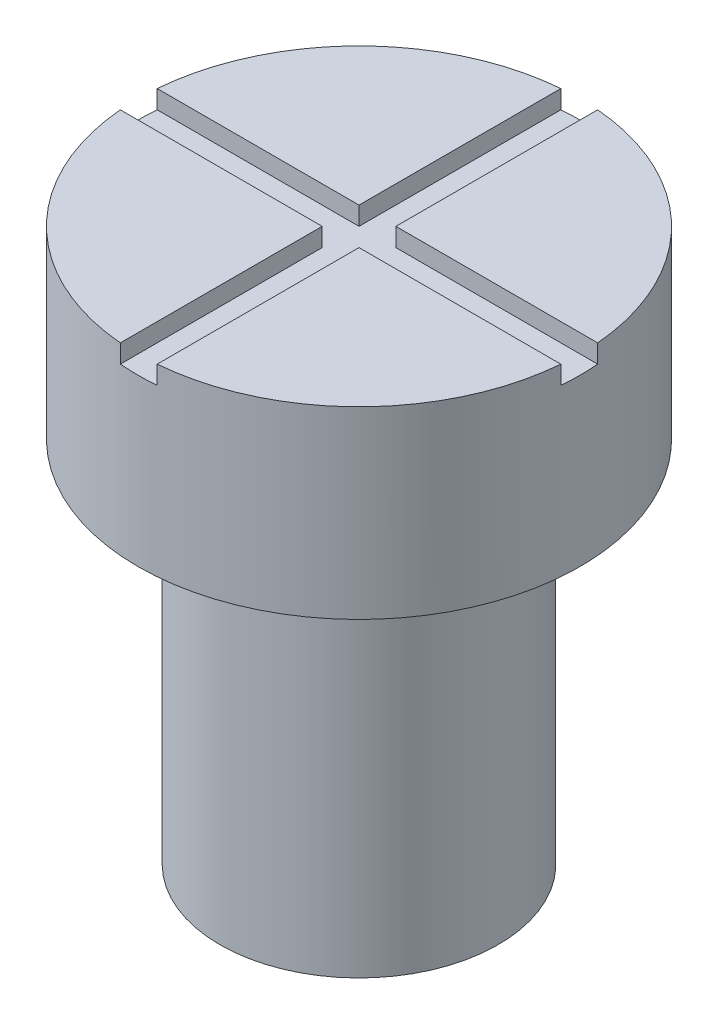
ISO-10303-21;
HEADER;
FILE_DESCRIPTION(('STEP AP214'),'2;1');
FILE_NAME('part.step','',(''),(''),'','','');
FILE_SCHEMA(('AUTOMOTIVE_DESIGN { 1 0 10303 214 1 1 1 1 }'));
ENDSEC;
DATA;
#1=APPLICATION_CONTEXT('core data for automotive mechanical design processes');
#2=APPLICATION_PROTOCOL_DEFINITION('international standard','automotive_design',2000,#1);
#3=PRODUCT_CONTEXT('',#1,'mechanical');
#4=PRODUCT('Part','Part','',(#3));
#5=PRODUCT_RELATED_PRODUCT_CATEGORY('part','',(#4));
#6=PRODUCT_DEFINITION_FORMATION('','',#4);
#7=PRODUCT_DEFINITION_CONTEXT('part definition',#1,'design');
#8=PRODUCT_DEFINITION('design','',#6,#7);
#9=PRODUCT_DEFINITION_SHAPE('','',#8);
#10=(LENGTH_UNIT() NAMED_UNIT(*) SI_UNIT(.MILLI.,.METRE.));
#11=(NAMED_UNIT(*) PLANE_ANGLE_UNIT() SI_UNIT($,.RADIAN.));
#12=(NAMED_UNIT(*) SI_UNIT($,.STERADIAN.) SOLID_ANGLE_UNIT());
#13=UNCERTAINTY_MEASURE_WITH_UNIT(LENGTH_MEASURE(1.E-05),#10,'distance_accuracy_value','');
#14=(GEOMETRIC_REPRESENTATION_CONTEXT(3) GLOBAL_UNCERTAINTY_ASSIGNED_CONTEXT((#13)) GLOBAL_UNIT_ASSIGNED_CONTEXT((#10,
#11,#12)) REPRESENTATION_CONTEXT('',''));
#15=CARTESIAN_POINT('',(0.,0.,0.));
#16=DIRECTION('',(0.,0.,1.));
#17=DIRECTION('',(1.,0.,0.));
#18=AXIS2_PLACEMENT_3D('',#15,#16,#17);
#19=CARTESIAN_POINT('',(-36.5815866293963,3.,-71.1049985381484));
#20=DIRECTION('',(0.,-1.,0.));
#21=DIRECTION('',(0.,0.,-1.));
#22=AXIS2_PLACEMENT_3D('',#19,#20,#21);
#23=CYLINDRICAL_SURFACE('',#22,1.2);
#24=CARTESIAN_POINT('',(-36.5815866293963,2.,-71.1049985381484));
#25=DIRECTION('',(0.,1.,0.));
#26=DIRECTION('',(0.,0.,1.));
#27=AXIS2_PLACEMENT_3D('',#24,#25,#26);
#28=CIRCLE('',#27,1.2);
#29=CARTESIAN_POINT('',(-36.5815866293963,2.,-69.9049985381484));
#30=VERTEX_POINT('',#29);
#31=EDGE_CURVE('E174',#30,#30,#28,.T.);
#32=ORIENTED_EDGE('',*,*,#31,.T.);
#33=EDGE_LOOP('',(#32));
#34=FACE_BOUND('',#33,.T.);
#35=DIRECTION('',(0.,1.,0.));
#36=VECTOR('',#35,1.);
#37=CARTESIAN_POINT('',(-35.3857605550862,2.9,-71.2049985381484));
#38=LINE('',#37,#36);
#39=CARTESIAN_POINT('',(-35.3857605550862,2.9,-71.2049985381484));
#40=VERTEX_POINT('',#39);
#41=CARTESIAN_POINT('',(-35.3857605550862,3.,-71.2049985381484));
#42=VERTEX_POINT('',#41);
#43=EDGE_CURVE('E182',#40,#42,#38,.T.);
#44=ORIENTED_EDGE('',*,*,#43,.F.);
#45=CARTESIAN_POINT('',(-36.5815866293963,2.9,-71.1049985381484));
#46=DIRECTION('',(0.,1.,0.));
#47=DIRECTION('',(0.,0.,1.));
#48=AXIS2_PLACEMENT_3D('',#45,#46,#47);
#49=CIRCLE('',#48,1.2);
#50=CARTESIAN_POINT('',(-35.3857605550862,2.9,-71.0049985381484));
#51=VERTEX_POINT('',#50);
#52=EDGE_CURVE('E152',#51,#40,#49,.T.);
#53=ORIENTED_EDGE('',*,*,#52,.F.);
#54=DIRECTION('',(0.,1.,0.));
#55=VECTOR('',#54,1.);
#56=CARTESIAN_POINT('',(-35.3857605550862,2.9,-71.0049985381484));
#57=LINE('',#56,#55);
#58=CARTESIAN_POINT('',(-35.3857605550862,3.,-71.0049985381484));
#59=VERTEX_POINT('',#58);
#60=EDGE_CURVE('E184',#51,#59,#57,.T.);
#61=ORIENTED_EDGE('',*,*,#60,.T.);
#62=CARTESIAN_POINT('',(-36.5815866293963,3.,-71.1049985381484));
#63=DIRECTION('',(0.,1.,0.));
#64=DIRECTION('',(0.,0.,1.));
#65=AXIS2_PLACEMENT_3D('',#62,#63,#64);
#66=CIRCLE('',#65,1.2);
#67=CARTESIAN_POINT('',(-36.4815866293963,3.,-69.9091724638383));
#68=VERTEX_POINT('',#67);
#69=EDGE_CURVE('E195',#68,#59,#66,.T.);
#70=ORIENTED_EDGE('',*,*,#69,.F.);
#71=DIRECTION('',(0.,1.,0.));
#72=VECTOR('',#71,1.);
#73=CARTESIAN_POINT('',(-36.4815866293963,2.9,-69.9091724638383));
#74=LINE('',#73,#72);
#75=CARTESIAN_POINT('',(-36.4815866293963,2.9,-69.9091724638383));
#76=VERTEX_POINT('',#75);
#77=EDGE_CURVE('E189',#76,#68,#74,.T.);
#78=ORIENTED_EDGE('',*,*,#77,.F.);
#79=CARTESIAN_POINT('',(-36.6815866293963,2.9,-69.9091724638383));
#80=VERTEX_POINT('',#79);
#81=EDGE_CURVE('E227',#80,#76,#49,.T.);
#82=ORIENTED_EDGE('',*,*,#81,.F.);
#83=DIRECTION('',(0.,1.,0.));
#84=VECTOR('',#83,1.);
#85=CARTESIAN_POINT('',(-36.6815866293963,2.9,-69.9091724638383));
#86=LINE('',#85,#84);
#87=CARTESIAN_POINT('',(-36.6815866293963,3.,-69.9091724638383));
#88=VERTEX_POINT('',#87);
#89=EDGE_CURVE('E191',#80,#88,#86,.T.);
#90=ORIENTED_EDGE('',*,*,#89,.T.);
#91=CARTESIAN_POINT('',(-37.7774127037064,3.,-71.0049985381484));
#92=VERTEX_POINT('',#91);
#93=EDGE_CURVE('E199',#92,#88,#66,.T.);
#94=ORIENTED_EDGE('',*,*,#93,.F.);
#95=DIRECTION('',(0.,1.,0.));
#96=VECTOR('',#95,1.);
#97=CARTESIAN_POINT('',(-37.7774127037064,2.9,-71.0049985381484));
#98=LINE('',#97,#96);
#99=CARTESIAN_POINT('',(-37.7774127037064,2.9,-71.0049985381484));
#100=VERTEX_POINT('',#99);
#101=EDGE_CURVE('E92',#100,#92,#98,.T.);
#102=ORIENTED_EDGE('',*,*,#101,.F.);
#103=CARTESIAN_POINT('',(-37.7774127037064,2.9,-71.2049985381484));
#104=VERTEX_POINT('',#103);
#105=EDGE_CURVE('E133',#104,#100,#49,.T.);
#106=ORIENTED_EDGE('',*,*,#105,.F.);
#107=DIRECTION('',(0.,1.,0.));
#108=VECTOR('',#107,1.);
#109=CARTESIAN_POINT('',(-37.7774127037064,2.9,-71.2049985381484));
#110=LINE('',#109,#108);
#111=CARTESIAN_POINT('',(-37.7774127037064,3.,-71.2049985381484));
#112=VERTEX_POINT('',#111);
#113=EDGE_CURVE('E129',#104,#112,#110,.T.);
#114=ORIENTED_EDGE('',*,*,#113,.T.);
#115=CARTESIAN_POINT('',(-36.6815866293963,3.,-72.3008246124585));
#116=VERTEX_POINT('',#115);
#117=EDGE_CURVE('E204',#116,#112,#66,.T.);
#118=ORIENTED_EDGE('',*,*,#117,.F.);
#119=DIRECTION('',(0.,1.,0.));
#120=VECTOR('',#119,1.);
#121=CARTESIAN_POINT('',(-36.6815866293963,2.9,-72.3008246124585));
#122=LINE('',#121,#120);
#123=CARTESIAN_POINT('',(-36.6815866293963,2.9,-72.3008246124585));
#124=VERTEX_POINT('',#123);
#125=EDGE_CURVE('E142',#124,#116,#122,.T.);
#126=ORIENTED_EDGE('',*,*,#125,.F.);
#127=CARTESIAN_POINT('',(-36.4815866293963,2.9,-72.3008246124585));
#128=VERTEX_POINT('',#127);
#129=EDGE_CURVE('E147',#128,#124,#49,.T.);
#130=ORIENTED_EDGE('',*,*,#129,.F.);
#131=DIRECTION('',(0.,1.,0.));
#132=VECTOR('',#131,1.);
#133=CARTESIAN_POINT('',(-36.4815866293963,2.9,-72.3008246124585));
#134=LINE('',#133,#132);
#135=CARTESIAN_POINT('',(-36.4815866293963,3.,-72.3008246124585));
#136=VERTEX_POINT('',#135);
#137=EDGE_CURVE('E177',#128,#136,#134,.T.);
#138=ORIENTED_EDGE('',*,*,#137,.T.);
#139=EDGE_CURVE('E198',#42,#136,#66,.T.);
#140=ORIENTED_EDGE('',*,*,#139,.F.);
#141=EDGE_LOOP('',(#44,#53,#61,#70,#78,#82,#90,#94,#102,#106,#114,#118,#126,#130,#138,#140));
#142=FACE_BOUND('',#141,.T.);
#143=ADVANCED_FACE('F32',(#34,#142),#23,.T.);
#144=CARTESIAN_POINT('',(-36.5815866293963,3.,-71.1049985381484));
#145=DIRECTION('',(0.,1.,0.));
#146=DIRECTION('',(0.,0.,1.));
#147=AXIS2_PLACEMENT_3D('',#144,#145,#146);
#148=PLANE('',#147);
#149=ORIENTED_EDGE('',*,*,#117,.T.);
#150=DIRECTION('',(1.,0.,0.));
#151=VECTOR('',#150,1.);
#152=CARTESIAN_POINT('',(-39.3630079856336,3.,-71.2049985381484));
#153=LINE('',#152,#151);
#154=CARTESIAN_POINT('',(-36.6815866293963,3.,-71.2049985381484));
#155=VERTEX_POINT('',#154);
#156=EDGE_CURVE('E171',#112,#155,#153,.T.);
#157=ORIENTED_EDGE('',*,*,#156,.T.);
#158=DIRECTION('',(0.,0.,1.));
#159=VECTOR('',#158,1.);
#160=CARTESIAN_POINT('',(-36.6815866293963,3.,-71.1049985381484));
#161=LINE('',#160,#159);
#162=EDGE_CURVE('E140',#116,#155,#161,.T.);
#163=ORIENTED_EDGE('',*,*,#162,.F.);
#164=EDGE_LOOP('',(#149,#157,#163));
#165=FACE_BOUND('',#164,.T.);
#166=ADVANCED_FACE('F246',(#165),#148,.T.);
#167=ORIENTED_EDGE('',*,*,#139,.T.);
#168=DIRECTION('',(0.,0.,1.));
#169=VECTOR('',#168,1.);
#170=CARTESIAN_POINT('',(-36.4815866293963,3.,-71.1049985381484));
#171=LINE('',#170,#169);
#172=CARTESIAN_POINT('',(-36.4815866293963,3.,-71.2049985381484));
#173=VERTEX_POINT('',#172);
#174=EDGE_CURVE('E167',#136,#173,#171,.T.);
#175=ORIENTED_EDGE('',*,*,#174,.T.);
#176=DIRECTION('',(1.,0.,0.));
#177=VECTOR('',#176,1.);
#178=CARTESIAN_POINT('',(-39.3630079856336,3.,-71.2049985381484));
#179=LINE('',#178,#177);
#180=EDGE_CURVE('E164',#173,#42,#179,.T.);
#181=ORIENTED_EDGE('',*,*,#180,.T.);
#182=EDGE_LOOP('',(#167,#175,#181));
#183=FACE_BOUND('',#182,.T.);
#184=ADVANCED_FACE('F214',(#183),#148,.T.);
#185=DIRECTION('',(1.,0.,0.));
#186=VECTOR('',#185,1.);
#187=CARTESIAN_POINT('',(-39.3630079856336,3.,-71.0049985381484));
#188=LINE('',#187,#186);
#189=CARTESIAN_POINT('',(-36.4815866293963,3.,-71.0049985381484));
#190=VERTEX_POINT('',#189);
#191=EDGE_CURVE('E162',#190,#59,#188,.T.);
#192=ORIENTED_EDGE('',*,*,#191,.F.);
#193=DIRECTION('',(0.,0.,1.));
#194=VECTOR('',#193,1.);
#195=CARTESIAN_POINT('',(-36.4815866293963,3.,-71.1049985381484));
#196=LINE('',#195,#194);
#197=EDGE_CURVE('E159',#190,#68,#196,.T.);
#198=ORIENTED_EDGE('',*,*,#197,.T.);
#199=ORIENTED_EDGE('',*,*,#69,.T.);
#200=EDGE_LOOP('',(#192,#198,#199));
#201=FACE_BOUND('',#200,.T.);
#202=ADVANCED_FACE('F247',(#201),#148,.T.);
#203=CARTESIAN_POINT('',(-36.5815866293963,2.,-71.1049985381484));
#204=DIRECTION('',(0.,-1.,0.));
#205=DIRECTION('',(0.,0.,-1.));
#206=AXIS2_PLACEMENT_3D('',#203,#204,#205);
#207=CYLINDRICAL_SURFACE('',#206,0.755649999999995);
#208=CARTESIAN_POINT('',(-36.5815866293963,2.,-71.1049985381484));
#209=DIRECTION('',(0.,1.,0.));
#210=DIRECTION('',(0.,0.,1.));
#211=AXIS2_PLACEMENT_3D('',#208,#209,#210);
#212=CIRCLE('',#211,0.755649999999995);
#213=CARTESIAN_POINT('',(-36.5815866293963,2.,-70.3493485381484));
#214=VERTEX_POINT('',#213);
#215=EDGE_CURVE('E11',#214,#214,#212,.T.);
#216=ORIENTED_EDGE('',*,*,#215,.F.);
#217=EDGE_LOOP('',(#216));
#218=FACE_BOUND('',#217,.T.);
#219=CARTESIAN_POINT('',(-36.5815866293963,0.,-71.1049985381484));
#220=DIRECTION('',(0.,1.,0.));
#221=DIRECTION('',(0.,0.,1.));
#222=AXIS2_PLACEMENT_3D('',#219,#220,#221);
#223=CIRCLE('',#222,0.755649999999995);
#224=CARTESIAN_POINT('',(-36.5815866293963,0.,-70.3493485381484));
#225=VERTEX_POINT('',#224);
#226=EDGE_CURVE('E36',#225,#225,#223,.T.);
#227=ORIENTED_EDGE('',*,*,#226,.T.);
#228=EDGE_LOOP('',(#227));
#229=FACE_BOUND('',#228,.T.);
#230=ADVANCED_FACE('F34',(#218,#229),#207,.T.);
#231=CARTESIAN_POINT('',(-36.5815866293963,0.,-71.1049985381484));
#232=DIRECTION('',(0.,1.,0.));
#233=DIRECTION('',(0.,0.,1.));
#234=AXIS2_PLACEMENT_3D('',#231,#232,#233);
#235=PLANE('',#234);
#236=ORIENTED_EDGE('',*,*,#226,.F.);
#237=EDGE_LOOP('',(#236));
#238=FACE_BOUND('',#237,.T.);
#239=ADVANCED_FACE('F253',(#238),#235,.F.);
#240=CARTESIAN_POINT('',(-36.5815866293963,2.,-71.1049985381484));
#241=DIRECTION('',(0.,1.,0.));
#242=DIRECTION('',(0.,0.,1.));
#243=AXIS2_PLACEMENT_3D('',#240,#241,#242);
#244=PLANE('',#243);
#245=ORIENTED_EDGE('',*,*,#31,.F.);
#246=EDGE_LOOP('',(#245));
#247=FACE_BOUND('',#246,.T.);
#248=ORIENTED_EDGE('',*,*,#215,.T.);
#249=EDGE_LOOP('',(#248));
#250=FACE_BOUND('',#249,.T.);
#251=ADVANCED_FACE('F244',(#247,#250),#244,.F.);
#252=DIRECTION('',(1.,0.,0.));
#253=VECTOR('',#252,1.);
#254=CARTESIAN_POINT('',(-39.3630079856336,3.,-71.0049985381484));
#255=LINE('',#254,#253);
#256=CARTESIAN_POINT('',(-36.6815866293963,3.,-71.0049985381484));
#257=VERTEX_POINT('',#256);
#258=EDGE_CURVE('E47',#92,#257,#255,.T.);
#259=ORIENTED_EDGE('',*,*,#258,.F.);
#260=ORIENTED_EDGE('',*,*,#93,.T.);
#261=DIRECTION('',(0.,0.,1.));
#262=VECTOR('',#261,1.);
#263=CARTESIAN_POINT('',(-36.6815866293963,3.,-71.1049985381484));
#264=LINE('',#263,#262);
#265=EDGE_CURVE('E157',#257,#88,#264,.T.);
#266=ORIENTED_EDGE('',*,*,#265,.F.);
#267=EDGE_LOOP('',(#259,#260,#266));
#268=FACE_BOUND('',#267,.T.);
#269=ADVANCED_FACE('F241',(#268),#148,.T.);
#270=CARTESIAN_POINT('',(-39.3630079856336,2.9,-71.0049985381484));
#271=DIRECTION('',(0.,0.,1.));
#272=DIRECTION('',(1.,0.,0.));
#273=AXIS2_PLACEMENT_3D('',#270,#271,#272);
#274=PLANE('',#273);
#275=ORIENTED_EDGE('',*,*,#258,.T.);
#276=DIRECTION('',(0.,1.,0.));
#277=VECTOR('',#276,1.);
#278=CARTESIAN_POINT('',(-36.6815866293963,2.9,-71.0049985381484));
#279=LINE('',#278,#277);
#280=CARTESIAN_POINT('',(-36.6815866293963,2.9,-71.0049985381484));
#281=VERTEX_POINT('',#280);
#282=EDGE_CURVE('E95',#281,#257,#279,.T.);
#283=ORIENTED_EDGE('',*,*,#282,.F.);
#284=DIRECTION('',(1.,0.,0.));
#285=VECTOR('',#284,1.);
#286=CARTESIAN_POINT('',(-39.3630079856336,2.9,-71.0049985381484));
#287=LINE('',#286,#285);
#288=EDGE_CURVE('E53',#100,#281,#287,.T.);
#289=ORIENTED_EDGE('',*,*,#288,.F.);
#290=ORIENTED_EDGE('',*,*,#101,.T.);
#291=EDGE_LOOP('',(#275,#283,#289,#290));
#292=FACE_BOUND('',#291,.T.);
#293=ADVANCED_FACE('F243',(#292),#274,.F.);
#294=CARTESIAN_POINT('',(-39.3630079856336,2.9,-71.2049985381484));
#295=DIRECTION('',(0.,0.,1.));
#296=DIRECTION('',(1.,0.,0.));
#297=AXIS2_PLACEMENT_3D('',#294,#295,#296);
#298=PLANE('',#297);
#299=ORIENTED_EDGE('',*,*,#156,.F.);
#300=ORIENTED_EDGE('',*,*,#113,.F.);
#301=DIRECTION('',(1.,0.,0.));
#302=VECTOR('',#301,1.);
#303=CARTESIAN_POINT('',(-39.3630079856336,2.9,-71.2049985381484));
#304=LINE('',#303,#302);
#305=CARTESIAN_POINT('',(-36.6815866293963,2.9,-71.2049985381484));
#306=VERTEX_POINT('',#305);
#307=EDGE_CURVE('E123',#104,#306,#304,.T.);
#308=ORIENTED_EDGE('',*,*,#307,.T.);
#309=DIRECTION('',(0.,1.,0.));
#310=VECTOR('',#309,1.);
#311=CARTESIAN_POINT('',(-36.6815866293963,2.9,-71.2049985381484));
#312=LINE('',#311,#310);
#313=EDGE_CURVE('E126',#306,#155,#312,.T.);
#314=ORIENTED_EDGE('',*,*,#313,.T.);
#315=EDGE_LOOP('',(#299,#300,#308,#314));
#316=FACE_BOUND('',#315,.T.);
#317=ADVANCED_FACE('F125',(#316),#298,.T.);
#318=CARTESIAN_POINT('',(-36.6815866293963,2.9,-71.1049985381484));
#319=DIRECTION('',(-1.,0.,0.));
#320=DIRECTION('',(0.,0.,1.));
#321=AXIS2_PLACEMENT_3D('',#318,#319,#320);
#322=PLANE('',#321);
#323=ORIENTED_EDGE('',*,*,#162,.T.);
#324=ORIENTED_EDGE('',*,*,#313,.F.);
#325=DIRECTION('',(0.,0.,1.));
#326=VECTOR('',#325,1.);
#327=CARTESIAN_POINT('',(-36.6815866293963,2.9,-71.1049985381484));
#328=LINE('',#327,#326);
#329=EDGE_CURVE('E134',#124,#306,#328,.T.);
#330=ORIENTED_EDGE('',*,*,#329,.F.);
#331=ORIENTED_EDGE('',*,*,#125,.T.);
#332=EDGE_LOOP('',(#323,#324,#330,#331));
#333=FACE_BOUND('',#332,.T.);
#334=ADVANCED_FACE('F137',(#333),#322,.F.);
#335=CARTESIAN_POINT('',(-36.4815866293963,2.9,-71.1049985381484));
#336=DIRECTION('',(-1.,0.,0.));
#337=DIRECTION('',(0.,0.,1.));
#338=AXIS2_PLACEMENT_3D('',#335,#336,#337);
#339=PLANE('',#338);
#340=ORIENTED_EDGE('',*,*,#174,.F.);
#341=ORIENTED_EDGE('',*,*,#137,.F.);
#342=DIRECTION('',(0.,0.,1.));
#343=VECTOR('',#342,1.);
#344=CARTESIAN_POINT('',(-36.4815866293963,2.9,-71.1049985381484));
#345=LINE('',#344,#343);
#346=CARTESIAN_POINT('',(-36.4815866293963,2.9,-71.2049985381484));
#347=VERTEX_POINT('',#346);
#348=EDGE_CURVE('E150',#128,#347,#345,.T.);
#349=ORIENTED_EDGE('',*,*,#348,.T.);
#350=DIRECTION('',(0.,1.,0.));
#351=VECTOR('',#350,1.);
#352=CARTESIAN_POINT('',(-36.4815866293963,2.9,-71.2049985381484));
#353=LINE('',#352,#351);
#354=EDGE_CURVE('E180',#347,#173,#353,.T.);
#355=ORIENTED_EDGE('',*,*,#354,.T.);
#356=EDGE_LOOP('',(#340,#341,#349,#355));
#357=FACE_BOUND('',#356,.T.);
#358=ADVANCED_FACE('F220',(#357),#339,.T.);
#359=CARTESIAN_POINT('',(-39.3630079856336,2.9,-71.2049985381484));
#360=DIRECTION('',(0.,0.,1.));
#361=DIRECTION('',(1.,0.,0.));
#362=AXIS2_PLACEMENT_3D('',#359,#360,#361);
#363=PLANE('',#362);
#364=ORIENTED_EDGE('',*,*,#180,.F.);
#365=ORIENTED_EDGE('',*,*,#354,.F.);
#366=DIRECTION('',(1.,0.,0.));
#367=VECTOR('',#366,1.);
#368=CARTESIAN_POINT('',(-39.3630079856336,2.9,-71.2049985381484));
#369=LINE('',#368,#367);
#370=EDGE_CURVE('E224',#347,#40,#369,.T.);
#371=ORIENTED_EDGE('',*,*,#370,.T.);
#372=ORIENTED_EDGE('',*,*,#43,.T.);
#373=EDGE_LOOP('',(#364,#365,#371,#372));
#374=FACE_BOUND('',#373,.T.);
#375=ADVANCED_FACE('F344',(#374),#363,.T.);
#376=CARTESIAN_POINT('',(-39.3630079856336,2.9,-71.0049985381484));
#377=DIRECTION('',(0.,0.,1.));
#378=DIRECTION('',(1.,0.,0.));
#379=AXIS2_PLACEMENT_3D('',#376,#377,#378);
#380=PLANE('',#379);
#381=ORIENTED_EDGE('',*,*,#191,.T.);
#382=ORIENTED_EDGE('',*,*,#60,.F.);
#383=DIRECTION('',(1.,0.,0.));
#384=VECTOR('',#383,1.);
#385=CARTESIAN_POINT('',(-39.3630079856336,2.9,-71.0049985381484));
#386=LINE('',#385,#384);
#387=CARTESIAN_POINT('',(-36.4815866293963,2.9,-71.0049985381484));
#388=VERTEX_POINT('',#387);
#389=EDGE_CURVE('E226',#388,#51,#386,.T.);
#390=ORIENTED_EDGE('',*,*,#389,.F.);
#391=DIRECTION('',(0.,1.,0.));
#392=VECTOR('',#391,1.);
#393=CARTESIAN_POINT('',(-36.4815866293963,2.9,-71.0049985381484));
#394=LINE('',#393,#392);
#395=EDGE_CURVE('E187',#388,#190,#394,.T.);
#396=ORIENTED_EDGE('',*,*,#395,.T.);
#397=EDGE_LOOP('',(#381,#382,#390,#396));
#398=FACE_BOUND('',#397,.T.);
#399=ADVANCED_FACE('F353',(#398),#380,.F.);
#400=CARTESIAN_POINT('',(-36.4815866293963,2.9,-71.1049985381484));
#401=DIRECTION('',(-1.,0.,0.));
#402=DIRECTION('',(0.,0.,1.));
#403=AXIS2_PLACEMENT_3D('',#400,#401,#402);
#404=PLANE('',#403);
#405=ORIENTED_EDGE('',*,*,#197,.F.);
#406=ORIENTED_EDGE('',*,*,#395,.F.);
#407=DIRECTION('',(0.,0.,1.));
#408=VECTOR('',#407,1.);
#409=CARTESIAN_POINT('',(-36.4815866293963,2.9,-71.1049985381484));
#410=LINE('',#409,#408);
#411=EDGE_CURVE('E231',#388,#76,#410,.T.);
#412=ORIENTED_EDGE('',*,*,#411,.T.);
#413=ORIENTED_EDGE('',*,*,#77,.T.);
#414=EDGE_LOOP('',(#405,#406,#412,#413));
#415=FACE_BOUND('',#414,.T.);
#416=ADVANCED_FACE('F362',(#415),#404,.T.);
#417=CARTESIAN_POINT('',(-36.6815866293963,2.9,-71.1049985381484));
#418=DIRECTION('',(-1.,0.,0.));
#419=DIRECTION('',(0.,0.,1.));
#420=AXIS2_PLACEMENT_3D('',#417,#418,#419);
#421=PLANE('',#420);
#422=ORIENTED_EDGE('',*,*,#265,.T.);
#423=ORIENTED_EDGE('',*,*,#89,.F.);
#424=DIRECTION('',(0.,0.,1.));
#425=VECTOR('',#424,1.);
#426=CARTESIAN_POINT('',(-36.6815866293963,2.9,-71.1049985381484));
#427=LINE('',#426,#425);
#428=EDGE_CURVE('E234',#281,#80,#427,.T.);
#429=ORIENTED_EDGE('',*,*,#428,.F.);
#430=ORIENTED_EDGE('',*,*,#282,.T.);
#431=EDGE_LOOP('',(#422,#423,#429,#430));
#432=FACE_BOUND('',#431,.T.);
#433=ADVANCED_FACE('F240',(#432),#421,.F.);
#434=CARTESIAN_POINT('',(-39.3630079856336,2.9,-71.1049985381484));
#435=DIRECTION('',(0.,1.,0.));
#436=DIRECTION('',(0.,0.,1.));
#437=AXIS2_PLACEMENT_3D('',#434,#435,#436);
#438=PLANE('',#437);
#439=ORIENTED_EDGE('',*,*,#288,.T.);
#440=ORIENTED_EDGE('',*,*,#428,.T.);
#441=ORIENTED_EDGE('',*,*,#81,.T.);
#442=ORIENTED_EDGE('',*,*,#411,.F.);
#443=ORIENTED_EDGE('',*,*,#389,.T.);
#444=ORIENTED_EDGE('',*,*,#52,.T.);
#445=ORIENTED_EDGE('',*,*,#370,.F.);
#446=ORIENTED_EDGE('',*,*,#348,.F.);
#447=ORIENTED_EDGE('',*,*,#129,.T.);
#448=ORIENTED_EDGE('',*,*,#329,.T.);
#449=ORIENTED_EDGE('',*,*,#307,.F.);
#450=ORIENTED_EDGE('',*,*,#105,.T.);
#451=EDGE_LOOP('',(#439,#440,#441,#442,#443,#444,#445,#446,#447,#448,#449,#450));
#452=FACE_BOUND('',#451,.T.);
#453=ADVANCED_FACE('F144',(#452),#438,.T.);
#454=CLOSED_SHELL('',(#143,#166,#184,#202,#230,#239,#251,#269,#293,#317,#334,#358,#375,#399,
#416,#433,#453));
#455=MANIFOLD_SOLID_BREP('B2',#454);
#456=ADVANCED_BREP_SHAPE_REPRESENTATION('',(#18,#455),#14);
#457=SHAPE_DEFINITION_REPRESENTATION(#9,#456);
ENDSEC;
END-ISO-10303-21;
